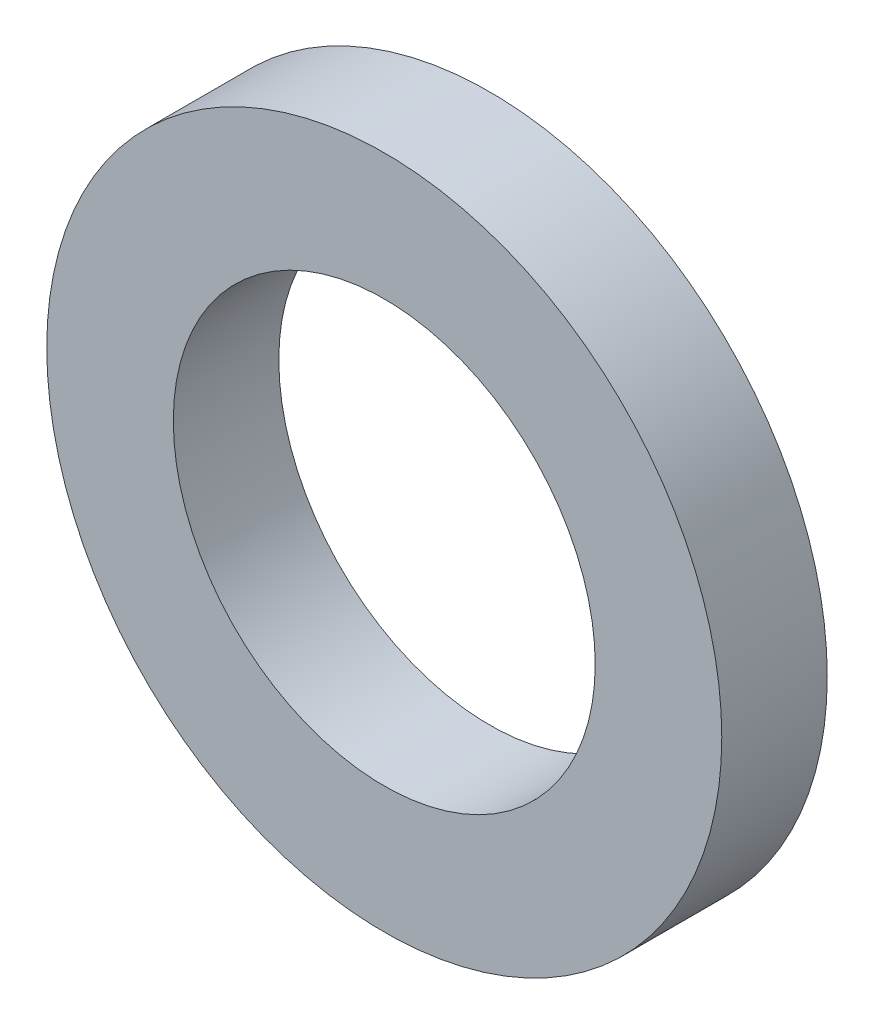
ISO-10303-21;
HEADER;
FILE_DESCRIPTION(('STEP AP214'),'2;1');
FILE_NAME('part.step','',(''),(''),'','','');
FILE_SCHEMA(('AUTOMOTIVE_DESIGN { 1 0 10303 214 1 1 1 1 }'));
ENDSEC;
DATA;
#1=APPLICATION_CONTEXT('core data for automotive mechanical design processes');
#2=APPLICATION_PROTOCOL_DEFINITION('international standard','automotive_design',2000,#1);
#3=PRODUCT_CONTEXT('',#1,'mechanical');
#4=PRODUCT('Part','Part','',(#3));
#5=PRODUCT_RELATED_PRODUCT_CATEGORY('part','',(#4));
#6=PRODUCT_DEFINITION_FORMATION('','',#4);
#7=PRODUCT_DEFINITION_CONTEXT('part definition',#1,'design');
#8=PRODUCT_DEFINITION('design','',#6,#7);
#9=PRODUCT_DEFINITION_SHAPE('','',#8);
#10=(LENGTH_UNIT() NAMED_UNIT(*) SI_UNIT(.MILLI.,.METRE.));
#11=(NAMED_UNIT(*) PLANE_ANGLE_UNIT() SI_UNIT($,.RADIAN.));
#12=(NAMED_UNIT(*) SI_UNIT($,.STERADIAN.) SOLID_ANGLE_UNIT());
#13=UNCERTAINTY_MEASURE_WITH_UNIT(LENGTH_MEASURE(1.E-05),#10,'distance_accuracy_value','');
#14=(GEOMETRIC_REPRESENTATION_CONTEXT(3) GLOBAL_UNCERTAINTY_ASSIGNED_CONTEXT((#13)) GLOBAL_UNIT_ASSIGNED_CONTEXT((#10,
#11,#12)) REPRESENTATION_CONTEXT('',''));
#15=CARTESIAN_POINT('',(0.,0.,0.));
#16=DIRECTION('',(0.,0.,1.));
#17=DIRECTION('',(1.,0.,0.));
#18=AXIS2_PLACEMENT_3D('',#15,#16,#17);
#19=CARTESIAN_POINT('',(0.,0.,-0.625));
#20=DIRECTION('',(0.,0.,1.));
#21=DIRECTION('',(1.,0.,0.));
#22=AXIS2_PLACEMENT_3D('',#19,#20,#21);
#23=PLANE('',#22);
#24=CARTESIAN_POINT('',(0.,0.,-0.625));
#25=DIRECTION('',(0.,0.,1.));
#26=DIRECTION('',(1.,0.,0.));
#27=AXIS2_PLACEMENT_3D('',#24,#25,#26);
#28=CIRCLE('',#27,2.5);
#29=CARTESIAN_POINT('',(2.5,0.,-0.625));
#30=VERTEX_POINT('',#29);
#31=EDGE_CURVE('E54',#30,#30,#28,.T.);
#32=ORIENTED_EDGE('',*,*,#31,.T.);
#33=EDGE_LOOP('',(#32));
#34=FACE_BOUND('',#33,.T.);
#35=CARTESIAN_POINT('',(0.,0.,-0.625));
#36=DIRECTION('',(0.,0.,1.));
#37=DIRECTION('',(1.,0.,0.));
#38=AXIS2_PLACEMENT_3D('',#35,#36,#37);
#39=CIRCLE('',#38,4.);
#40=CARTESIAN_POINT('',(4.,0.,-0.625));
#41=VERTEX_POINT('',#40);
#42=EDGE_CURVE('E57',#41,#41,#39,.T.);
#43=ORIENTED_EDGE('',*,*,#42,.F.);
#44=EDGE_LOOP('',(#43));
#45=FACE_BOUND('',#44,.T.);
#46=ADVANCED_FACE('F17',(#34,#45),#23,.F.);
#47=CARTESIAN_POINT('',(0.,0.,0.625));
#48=DIRECTION('',(0.,0.,1.));
#49=DIRECTION('',(1.,0.,0.));
#50=AXIS2_PLACEMENT_3D('',#47,#48,#49);
#51=PLANE('',#50);
#52=CARTESIAN_POINT('',(0.,0.,0.625));
#53=DIRECTION('',(0.,0.,1.));
#54=DIRECTION('',(1.,0.,0.));
#55=AXIS2_PLACEMENT_3D('',#52,#53,#54);
#56=CIRCLE('',#55,2.5);
#57=CARTESIAN_POINT('',(2.5,0.,0.625));
#58=VERTEX_POINT('',#57);
#59=EDGE_CURVE('E63',#58,#58,#56,.T.);
#60=ORIENTED_EDGE('',*,*,#59,.F.);
#61=EDGE_LOOP('',(#60));
#62=FACE_BOUND('',#61,.T.);
#63=CARTESIAN_POINT('',(0.,0.,0.625));
#64=DIRECTION('',(0.,0.,1.));
#65=DIRECTION('',(1.,0.,0.));
#66=AXIS2_PLACEMENT_3D('',#63,#64,#65);
#67=CIRCLE('',#66,4.);
#68=CARTESIAN_POINT('',(4.,0.,0.625));
#69=VERTEX_POINT('',#68);
#70=EDGE_CURVE('E11',#69,#69,#67,.T.);
#71=ORIENTED_EDGE('',*,*,#70,.T.);
#72=EDGE_LOOP('',(#71));
#73=FACE_BOUND('',#72,.T.);
#74=ADVANCED_FACE('F71',(#62,#73),#51,.T.);
#75=CARTESIAN_POINT('',(0.,0.,0.625));
#76=DIRECTION('',(0.,0.,-1.));
#77=DIRECTION('',(-1.,0.,0.));
#78=AXIS2_PLACEMENT_3D('',#75,#76,#77);
#79=CYLINDRICAL_SURFACE('',#78,4.);
#80=ORIENTED_EDGE('',*,*,#42,.T.);
#81=DIRECTION('',(0.,0.,1.));
#82=VECTOR('',#81,1.);
#83=CARTESIAN_POINT('',(4.,0.,0.625));
#84=LINE('',#83,#82);
#85=EDGE_CURVE('E21',#41,#69,#84,.T.);
#86=ORIENTED_EDGE('',*,*,#85,.T.);
#87=ORIENTED_EDGE('',*,*,#70,.F.);
#88=ORIENTED_EDGE('',*,*,#85,.F.);
#89=EDGE_LOOP('',(#80,#86,#87,#88));
#90=FACE_BOUND('',#89,.T.);
#91=ADVANCED_FACE('F19',(#90),#79,.T.);
#92=CARTESIAN_POINT('',(0.,0.,0.625));
#93=DIRECTION('',(0.,0.,-1.));
#94=DIRECTION('',(-1.,0.,0.));
#95=AXIS2_PLACEMENT_3D('',#92,#93,#94);
#96=CYLINDRICAL_SURFACE('',#95,2.5);
#97=ORIENTED_EDGE('',*,*,#59,.T.);
#98=DIRECTION('',(0.,0.,-1.));
#99=VECTOR('',#98,1.);
#100=CARTESIAN_POINT('',(2.5,0.,0.625));
#101=LINE('',#100,#99);
#102=EDGE_CURVE('E48',#58,#30,#101,.T.);
#103=ORIENTED_EDGE('',*,*,#102,.T.);
#104=ORIENTED_EDGE('',*,*,#31,.F.);
#105=ORIENTED_EDGE('',*,*,#102,.F.);
#106=EDGE_LOOP('',(#97,#103,#104,#105));
#107=FACE_BOUND('',#106,.T.);
#108=ADVANCED_FACE('F69',(#107),#96,.F.);
#109=CLOSED_SHELL('',(#46,#74,#91,#108));
#110=MANIFOLD_SOLID_BREP('B1',#109);
#111=ADVANCED_BREP_SHAPE_REPRESENTATION('',(#18,#110),#14);
#112=SHAPE_DEFINITION_REPRESENTATION(#9,#111);
ENDSEC;
END-ISO-10303-21;
